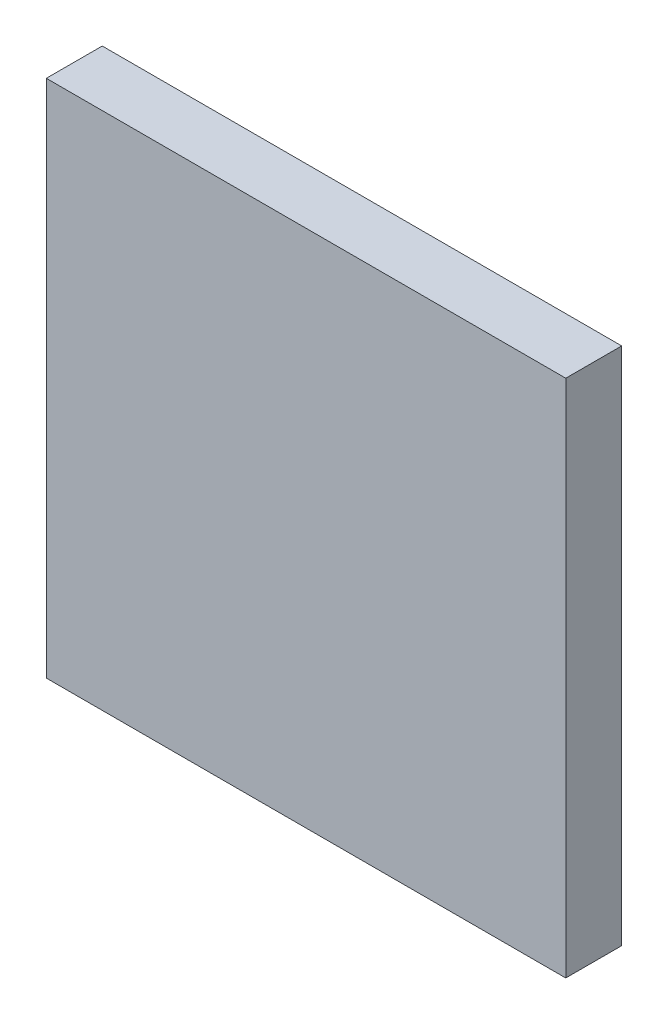
ISO-10303-21;
HEADER;
FILE_DESCRIPTION(('STEP AP214'),'2;1');
FILE_NAME('part.step','',(''),(''),'','','');
FILE_SCHEMA(('AUTOMOTIVE_DESIGN { 1 0 10303 214 1 1 1 1 }'));
ENDSEC;
DATA;
#1=APPLICATION_CONTEXT('core data for automotive mechanical design processes');
#2=APPLICATION_PROTOCOL_DEFINITION('international standard','automotive_design',2000,#1);
#3=PRODUCT_CONTEXT('',#1,'mechanical');
#4=PRODUCT('Part','Part','',(#3));
#5=PRODUCT_RELATED_PRODUCT_CATEGORY('part','',(#4));
#6=PRODUCT_DEFINITION_FORMATION('','',#4);
#7=PRODUCT_DEFINITION_CONTEXT('part definition',#1,'design');
#8=PRODUCT_DEFINITION('design','',#6,#7);
#9=PRODUCT_DEFINITION_SHAPE('','',#8);
#10=(LENGTH_UNIT() NAMED_UNIT(*) SI_UNIT(.MILLI.,.METRE.));
#11=(NAMED_UNIT(*) PLANE_ANGLE_UNIT() SI_UNIT($,.RADIAN.));
#12=(NAMED_UNIT(*) SI_UNIT($,.STERADIAN.) SOLID_ANGLE_UNIT());
#13=UNCERTAINTY_MEASURE_WITH_UNIT(LENGTH_MEASURE(1.E-05),#10,'distance_accuracy_value','');
#14=(GEOMETRIC_REPRESENTATION_CONTEXT(3) GLOBAL_UNCERTAINTY_ASSIGNED_CONTEXT((#13)) GLOBAL_UNIT_ASSIGNED_CONTEXT((#10,
#11,#12)) REPRESENTATION_CONTEXT('',''));
#15=CARTESIAN_POINT('',(0.,0.,0.));
#16=DIRECTION('',(0.,0.,1.));
#17=DIRECTION('',(1.,0.,0.));
#18=AXIS2_PLACEMENT_3D('',#15,#16,#17);
#19=CARTESIAN_POINT('',(0.,0.,1.778));
#20=DIRECTION('',(1.,0.,0.));
#21=DIRECTION('',(0.,0.,-1.));
#22=AXIS2_PLACEMENT_3D('',#19,#20,#21);
#23=PLANE('',#22);
#24=DIRECTION('',(0.,-1.,0.));
#25=VECTOR('',#24,1.);
#26=CARTESIAN_POINT('',(0.,0.,0.));
#27=LINE('',#26,#25);
#28=CARTESIAN_POINT('',(0.,16.51,0.));
#29=VERTEX_POINT('',#28);
#30=CARTESIAN_POINT('',(0.,0.,0.));
#31=VERTEX_POINT('',#30);
#32=EDGE_CURVE('E96',#29,#31,#27,.T.);
#33=ORIENTED_EDGE('',*,*,#32,.T.);
#34=DIRECTION('',(0.,0.,-1.));
#35=VECTOR('',#34,1.);
#36=CARTESIAN_POINT('',(0.,0.,1.778));
#37=LINE('',#36,#35);
#38=CARTESIAN_POINT('',(0.,0.,1.778));
#39=VERTEX_POINT('',#38);
#40=EDGE_CURVE('E11',#39,#31,#37,.T.);
#41=ORIENTED_EDGE('',*,*,#40,.F.);
#42=DIRECTION('',(0.,-1.,0.));
#43=VECTOR('',#42,1.);
#44=CARTESIAN_POINT('',(0.,0.,1.778));
#45=LINE('',#44,#43);
#46=CARTESIAN_POINT('',(0.,16.51,1.778));
#47=VERTEX_POINT('',#46);
#48=EDGE_CURVE('E84',#47,#39,#45,.T.);
#49=ORIENTED_EDGE('',*,*,#48,.F.);
#50=DIRECTION('',(0.,0.,-1.));
#51=VECTOR('',#50,1.);
#52=CARTESIAN_POINT('',(0.,16.51,1.778));
#53=LINE('',#52,#51);
#54=EDGE_CURVE('E92',#47,#29,#53,.T.);
#55=ORIENTED_EDGE('',*,*,#54,.T.);
#56=EDGE_LOOP('',(#33,#41,#49,#55));
#57=FACE_BOUND('',#56,.T.);
#58=ADVANCED_FACE('F33',(#57),#23,.F.);
#59=CARTESIAN_POINT('',(0.,0.,1.778));
#60=DIRECTION('',(0.,1.,0.));
#61=DIRECTION('',(0.,0.,1.));
#62=AXIS2_PLACEMENT_3D('',#59,#60,#61);
#63=PLANE('',#62);
#64=DIRECTION('',(1.,0.,0.));
#65=VECTOR('',#64,1.);
#66=CARTESIAN_POINT('',(0.,0.,0.));
#67=LINE('',#66,#65);
#68=CARTESIAN_POINT('',(16.51,0.,0.));
#69=VERTEX_POINT('',#68);
#70=EDGE_CURVE('E88',#31,#69,#67,.T.);
#71=ORIENTED_EDGE('',*,*,#70,.T.);
#72=DIRECTION('',(0.,0.,-1.));
#73=VECTOR('',#72,1.);
#74=CARTESIAN_POINT('',(16.51,0.,1.778));
#75=LINE('',#74,#73);
#76=CARTESIAN_POINT('',(16.51,0.,1.778));
#77=VERTEX_POINT('',#76);
#78=EDGE_CURVE('E41',#77,#69,#75,.T.);
#79=ORIENTED_EDGE('',*,*,#78,.F.);
#80=DIRECTION('',(1.,0.,0.));
#81=VECTOR('',#80,1.);
#82=CARTESIAN_POINT('',(0.,0.,1.778));
#83=LINE('',#82,#81);
#84=EDGE_CURVE('E79',#39,#77,#83,.T.);
#85=ORIENTED_EDGE('',*,*,#84,.F.);
#86=ORIENTED_EDGE('',*,*,#40,.T.);
#87=EDGE_LOOP('',(#71,#79,#85,#86));
#88=FACE_BOUND('',#87,.T.);
#89=ADVANCED_FACE('F87',(#88),#63,.F.);
#90=CARTESIAN_POINT('',(16.51,0.,1.778));
#91=DIRECTION('',(-1.,0.,0.));
#92=DIRECTION('',(0.,0.,1.));
#93=AXIS2_PLACEMENT_3D('',#90,#91,#92);
#94=PLANE('',#93);
#95=DIRECTION('',(0.,1.,0.));
#96=VECTOR('',#95,1.);
#97=CARTESIAN_POINT('',(16.51,0.,0.));
#98=LINE('',#97,#96);
#99=CARTESIAN_POINT('',(16.51,16.51,0.));
#100=VERTEX_POINT('',#99);
#101=EDGE_CURVE('E66',#69,#100,#98,.T.);
#102=ORIENTED_EDGE('',*,*,#101,.T.);
#103=DIRECTION('',(0.,0.,-1.));
#104=VECTOR('',#103,1.);
#105=CARTESIAN_POINT('',(16.51,16.51,1.778));
#106=LINE('',#105,#104);
#107=CARTESIAN_POINT('',(16.51,16.51,1.778));
#108=VERTEX_POINT('',#107);
#109=EDGE_CURVE('E89',#108,#100,#106,.T.);
#110=ORIENTED_EDGE('',*,*,#109,.F.);
#111=DIRECTION('',(0.,1.,0.));
#112=VECTOR('',#111,1.);
#113=CARTESIAN_POINT('',(16.51,0.,1.778));
#114=LINE('',#113,#112);
#115=EDGE_CURVE('E82',#77,#108,#114,.T.);
#116=ORIENTED_EDGE('',*,*,#115,.F.);
#117=ORIENTED_EDGE('',*,*,#78,.T.);
#118=EDGE_LOOP('',(#102,#110,#116,#117));
#119=FACE_BOUND('',#118,.T.);
#120=ADVANCED_FACE('F90',(#119),#94,.F.);
#121=CARTESIAN_POINT('',(0.,16.51,1.778));
#122=DIRECTION('',(0.,-1.,0.));
#123=DIRECTION('',(0.,0.,-1.));
#124=AXIS2_PLACEMENT_3D('',#121,#122,#123);
#125=PLANE('',#124);
#126=DIRECTION('',(-1.,0.,0.));
#127=VECTOR('',#126,1.);
#128=CARTESIAN_POINT('',(0.,16.51,0.));
#129=LINE('',#128,#127);
#130=EDGE_CURVE('E72',#100,#29,#129,.T.);
#131=ORIENTED_EDGE('',*,*,#130,.T.);
#132=ORIENTED_EDGE('',*,*,#54,.F.);
#133=DIRECTION('',(-1.,0.,0.));
#134=VECTOR('',#133,1.);
#135=CARTESIAN_POINT('',(0.,16.51,1.778));
#136=LINE('',#135,#134);
#137=EDGE_CURVE('E49',#108,#47,#136,.T.);
#138=ORIENTED_EDGE('',*,*,#137,.F.);
#139=ORIENTED_EDGE('',*,*,#109,.T.);
#140=EDGE_LOOP('',(#131,#132,#138,#139));
#141=FACE_BOUND('',#140,.T.);
#142=ADVANCED_FACE('F103',(#141),#125,.F.);
#143=CARTESIAN_POINT('',(0.,0.,1.778));
#144=DIRECTION('',(0.,0.,-1.));
#145=DIRECTION('',(-1.,0.,0.));
#146=AXIS2_PLACEMENT_3D('',#143,#144,#145);
#147=PLANE('',#146);
#148=ORIENTED_EDGE('',*,*,#48,.T.);
#149=ORIENTED_EDGE('',*,*,#84,.T.);
#150=ORIENTED_EDGE('',*,*,#115,.T.);
#151=ORIENTED_EDGE('',*,*,#137,.T.);
#152=EDGE_LOOP('',(#148,#149,#150,#151));
#153=FACE_BOUND('',#152,.T.);
#154=ADVANCED_FACE('F80',(#153),#147,.F.);
#155=CARTESIAN_POINT('',(0.,0.,0.));
#156=DIRECTION('',(0.,0.,-1.));
#157=DIRECTION('',(-1.,0.,0.));
#158=AXIS2_PLACEMENT_3D('',#155,#156,#157);
#159=PLANE('',#158);
#160=ORIENTED_EDGE('',*,*,#32,.F.);
#161=ORIENTED_EDGE('',*,*,#130,.F.);
#162=ORIENTED_EDGE('',*,*,#101,.F.);
#163=ORIENTED_EDGE('',*,*,#70,.F.);
#164=EDGE_LOOP('',(#160,#161,#162,#163));
#165=FACE_BOUND('',#164,.T.);
#166=ADVANCED_FACE('F106',(#165),#159,.T.);
#167=CLOSED_SHELL('',(#58,#89,#120,#142,#154,#166));
#168=MANIFOLD_SOLID_BREP('B2',#167);
#169=ADVANCED_BREP_SHAPE_REPRESENTATION('',(#18,#168),#14);
#170=SHAPE_DEFINITION_REPRESENTATION(#9,#169);
ENDSEC;
END-ISO-10303-21;
